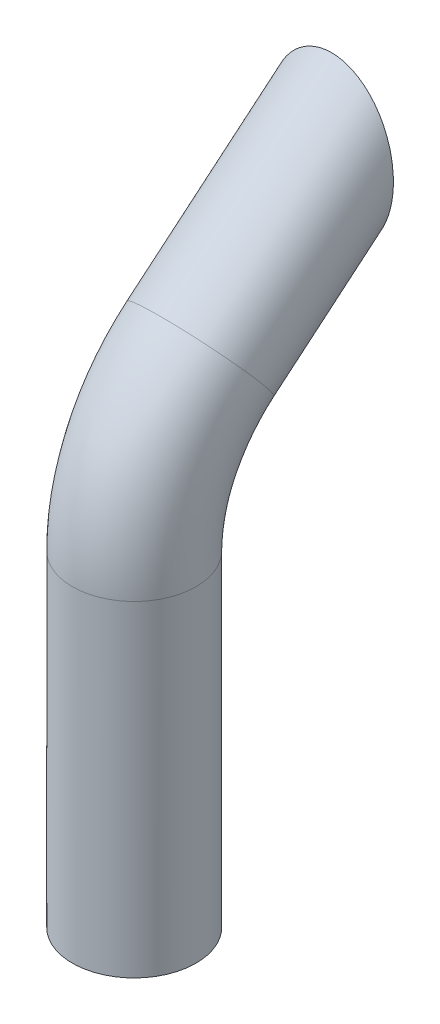
ISO-10303-21;
HEADER;
FILE_DESCRIPTION(('STEP AP214'),'2;1');
FILE_NAME('part.step','',(''),(''),'','','');
FILE_SCHEMA(('AUTOMOTIVE_DESIGN { 1 0 10303 214 1 1 1 1 }'));
ENDSEC;
DATA;
#1=APPLICATION_CONTEXT('core data for automotive mechanical design processes');
#2=APPLICATION_PROTOCOL_DEFINITION('international standard','automotive_design',2000,#1);
#3=PRODUCT_CONTEXT('',#1,'mechanical');
#4=PRODUCT('Part','Part','',(#3));
#5=PRODUCT_RELATED_PRODUCT_CATEGORY('part','',(#4));
#6=PRODUCT_DEFINITION_FORMATION('','',#4);
#7=PRODUCT_DEFINITION_CONTEXT('part definition',#1,'design');
#8=PRODUCT_DEFINITION('design','',#6,#7);
#9=PRODUCT_DEFINITION_SHAPE('','',#8);
#10=(LENGTH_UNIT() NAMED_UNIT(*) SI_UNIT(.MILLI.,.METRE.));
#11=(NAMED_UNIT(*) PLANE_ANGLE_UNIT() SI_UNIT($,.RADIAN.));
#12=(NAMED_UNIT(*) SI_UNIT($,.STERADIAN.) SOLID_ANGLE_UNIT());
#13=UNCERTAINTY_MEASURE_WITH_UNIT(LENGTH_MEASURE(1.E-05),#10,'distance_accuracy_value','');
#14=(GEOMETRIC_REPRESENTATION_CONTEXT(3) GLOBAL_UNCERTAINTY_ASSIGNED_CONTEXT((#13)) GLOBAL_UNIT_ASSIGNED_CONTEXT((#10,
#11,#12)) REPRESENTATION_CONTEXT('',''));
#15=CARTESIAN_POINT('',(0.,0.,0.));
#16=DIRECTION('',(0.,0.,1.));
#17=DIRECTION('',(1.,0.,0.));
#18=AXIS2_PLACEMENT_3D('',#15,#16,#17);
#19=CARTESIAN_POINT('',(0.,-296.418141452981,114.906666467847));
#20=DIRECTION('',(0.,-1.,0.));
#21=DIRECTION('',(0.,0.,-1.));
#22=AXIS2_PLACEMENT_3D('',#19,#20,#21);
#23=PLANE('',#22);
#24=CARTESIAN_POINT('',(0.,-296.418141452981,114.906666467847));
#25=DIRECTION('',(0.,-1.,0.));
#26=DIRECTION('',(0.,0.,-1.));
#27=AXIS2_PLACEMENT_3D('',#24,#25,#26);
#28=CIRCLE('',#27,27.);
#29=CARTESIAN_POINT('',(0.,-296.418141452981,87.9066664678469));
#30=VERTEX_POINT('',#29);
#31=EDGE_CURVE('E53',#30,#30,#28,.T.);
#32=ORIENTED_EDGE('',*,*,#31,.F.);
#33=EDGE_LOOP('',(#32));
#34=FACE_BOUND('',#33,.T.);
#35=CARTESIAN_POINT('',(0.,-296.418141452981,114.906666467847));
#36=DIRECTION('',(0.,-1.,0.));
#37=DIRECTION('',(0.,0.,-1.));
#38=AXIS2_PLACEMENT_3D('',#35,#36,#37);
#39=CIRCLE('',#38,30.);
#40=CARTESIAN_POINT('',(0.,-296.418141452981,84.9066664678469));
#41=VERTEX_POINT('',#40);
#42=EDGE_CURVE('E10',#41,#41,#39,.T.);
#43=ORIENTED_EDGE('',*,*,#42,.T.);
#44=EDGE_LOOP('',(#43));
#45=FACE_BOUND('',#44,.T.);
#46=ADVANCED_FACE('F37',(#34,#45),#23,.T.);
#47=CARTESIAN_POINT('',(0.,0.,0.));
#48=DIRECTION('',(0.,-0.642787609686538,0.766044443118979));
#49=DIRECTION('',(0.,-0.766044443118979,-0.642787609686538));
#50=AXIS2_PLACEMENT_3D('',#47,#48,#49);
#51=CYLINDRICAL_SURFACE('',#50,30.);
#52=CARTESIAN_POINT('',(0.,-16.1808853863989,19.2836282905961));
#53=DIRECTION('',(0.,0.,1.));
#54=DIRECTION('',(0.,-1.,0.));
#55=AXIS2_PLACEMENT_3D('',#52,#53,#54);
#56=ELLIPSE('',#55,39.1622186799683,30.);
#57=CARTESIAN_POINT('',(0.,-55.3431040663672,19.2836282905961));
#58=VERTEX_POINT('',#57);
#59=EDGE_CURVE('E62',#58,#58,#56,.F.);
#60=ORIENTED_EDGE('',*,*,#59,.F.);
#61=EDGE_LOOP('',(#60));
#62=FACE_BOUND('',#61,.T.);
#63=CARTESIAN_POINT('',(0.,-69.4418308062222,82.757551339635));
#64=DIRECTION('',(0.,-0.642787609686538,0.766044443118979));
#65=DIRECTION('',(0.,-0.766044443118979,-0.642787609686538));
#66=AXIS2_PLACEMENT_3D('',#63,#64,#65);
#67=CIRCLE('',#66,30.);
#68=CARTESIAN_POINT('',(0.,-46.4604975126528,102.041179630231));
#69=VERTEX_POINT('',#68);
#70=EDGE_CURVE('E48',#69,#69,#67,.T.);
#71=ORIENTED_EDGE('',*,*,#70,.F.);
#72=EDGE_LOOP('',(#71));
#73=FACE_BOUND('',#72,.T.);
#74=ADVANCED_FACE('F92',(#62,#73),#51,.T.);
#75=CARTESIAN_POINT('',(0.,-138.385830686931,24.9066664678469));
#76=DIRECTION('',(1.,0.,0.));
#77=DIRECTION('',(0.,0.,-1.));
#78=AXIS2_PLACEMENT_3D('',#75,#76,#77);
#79=TOROIDAL_SURFACE('',#78,90.,30.);
#80=CARTESIAN_POINT('',(0.,-138.385830686931,114.906666467847));
#81=DIRECTION('',(0.,-1.,0.));
#82=DIRECTION('',(0.,0.,-1.));
#83=AXIS2_PLACEMENT_3D('',#80,#81,#82);
#84=CIRCLE('',#83,30.);
#85=CARTESIAN_POINT('',(0.,-138.385830686931,144.906666467847));
#86=VERTEX_POINT('',#85);
#87=EDGE_CURVE('E44',#86,#86,#84,.T.);
#88=CARTESIAN_POINT('',(0.,-138.385830686931,24.9066664678469));
#89=DIRECTION('',(1.,0.,0.));
#90=DIRECTION('',(0.,0.,-1.));
#91=AXIS2_PLACEMENT_3D('',#88,#89,#90);
#92=CIRCLE('',#91,120.);
#93=EDGE_CURVE('',#69,#86,#92,.T.);
#94=ORIENTED_EDGE('',*,*,#70,.T.);
#95=ORIENTED_EDGE('',*,*,#87,.F.);
#96=ORIENTED_EDGE('',*,*,#93,.T.);
#97=ORIENTED_EDGE('',*,*,#93,.F.);
#98=EDGE_LOOP('',(#94,#96,#95,#97));
#99=FACE_BOUND('',#98,.T.);
#100=ADVANCED_FACE('F86',(#99),#79,.T.);
#101=CARTESIAN_POINT('',(0.,-138.385830686931,114.906666467847));
#102=DIRECTION('',(0.,-1.,0.));
#103=DIRECTION('',(0.,0.,-1.));
#104=AXIS2_PLACEMENT_3D('',#101,#102,#103);
#105=CYLINDRICAL_SURFACE('',#104,30.);
#106=ORIENTED_EDGE('',*,*,#42,.F.);
#107=EDGE_LOOP('',(#106));
#108=FACE_BOUND('',#107,.T.);
#109=ORIENTED_EDGE('',*,*,#87,.T.);
#110=EDGE_LOOP('',(#109));
#111=FACE_BOUND('',#110,.T.);
#112=ADVANCED_FACE('F84',(#108,#111),#105,.T.);
#113=CARTESIAN_POINT('',(0.,0.,0.));
#114=DIRECTION('',(0.,-0.642787609686538,0.766044443118979));
#115=DIRECTION('',(0.,-0.766044443118979,-0.642787609686538));
#116=AXIS2_PLACEMENT_3D('',#113,#114,#115);
#117=CYLINDRICAL_SURFACE('',#116,27.);
#118=CARTESIAN_POINT('',(0.,-16.1808853863989,19.2836282905961));
#119=DIRECTION('',(0.,0.,1.));
#120=DIRECTION('',(0.,-1.,0.));
#121=AXIS2_PLACEMENT_3D('',#118,#119,#120);
#122=ELLIPSE('',#121,35.2459968119715,27.);
#123=CARTESIAN_POINT('',(0.,-51.4268821983704,19.2836282905961));
#124=VERTEX_POINT('',#123);
#125=EDGE_CURVE('E40',#124,#124,#122,.F.);
#126=ORIENTED_EDGE('',*,*,#125,.T.);
#127=EDGE_LOOP('',(#126));
#128=FACE_BOUND('',#127,.T.);
#129=CARTESIAN_POINT('',(0.,-69.4418308062223,82.7575513396351));
#130=DIRECTION('',(0.,0.642787609686535,-0.766044443118981));
#131=DIRECTION('',(0.,0.766044443118981,0.642787609686535));
#132=AXIS2_PLACEMENT_3D('',#129,#130,#131);
#133=CIRCLE('',#132,27.);
#134=CARTESIAN_POINT('',(0.,-48.7586308420098,100.112816801171));
#135=VERTEX_POINT('',#134);
#136=EDGE_CURVE('E59',#135,#135,#133,.F.);
#137=ORIENTED_EDGE('',*,*,#136,.T.);
#138=EDGE_LOOP('',(#137));
#139=FACE_BOUND('',#138,.T.);
#140=ADVANCED_FACE('F69',(#128,#139),#117,.F.);
#141=CARTESIAN_POINT('',(0.,-138.385830686931,24.9066664678469));
#142=DIRECTION('',(1.,0.,0.));
#143=DIRECTION('',(0.,0.,-1.));
#144=AXIS2_PLACEMENT_3D('',#141,#142,#143);
#145=TOROIDAL_SURFACE('',#144,90.,27.);
#146=CARTESIAN_POINT('',(0.,-138.385830686931,114.906666467847));
#147=DIRECTION('',(0.,-1.,0.));
#148=DIRECTION('',(0.,0.,-1.));
#149=AXIS2_PLACEMENT_3D('',#146,#147,#148);
#150=CIRCLE('',#149,27.);
#151=CARTESIAN_POINT('',(0.,-138.385830686931,141.906666467847));
#152=VERTEX_POINT('',#151);
#153=EDGE_CURVE('E56',#152,#152,#150,.T.);
#154=CARTESIAN_POINT('',(0.,-138.385830686931,24.9066664678469));
#155=DIRECTION('',(1.,0.,0.));
#156=DIRECTION('',(0.,0.,-1.));
#157=AXIS2_PLACEMENT_3D('',#154,#155,#156);
#158=CIRCLE('',#157,117.);
#159=EDGE_CURVE('',#135,#152,#158,.T.);
#160=ORIENTED_EDGE('',*,*,#136,.F.);
#161=ORIENTED_EDGE('',*,*,#153,.T.);
#162=ORIENTED_EDGE('',*,*,#159,.T.);
#163=ORIENTED_EDGE('',*,*,#159,.F.);
#164=EDGE_LOOP('',(#160,#162,#161,#163));
#165=FACE_BOUND('',#164,.T.);
#166=ADVANCED_FACE('F80',(#165),#145,.F.);
#167=CARTESIAN_POINT('',(0.,-138.385830686931,114.906666467847));
#168=DIRECTION('',(0.,-1.,0.));
#169=DIRECTION('',(0.,0.,-1.));
#170=AXIS2_PLACEMENT_3D('',#167,#168,#169);
#171=CYLINDRICAL_SURFACE('',#170,27.);
#172=ORIENTED_EDGE('',*,*,#31,.T.);
#173=EDGE_LOOP('',(#172));
#174=FACE_BOUND('',#173,.T.);
#175=ORIENTED_EDGE('',*,*,#153,.F.);
#176=EDGE_LOOP('',(#175));
#177=FACE_BOUND('',#176,.T.);
#178=ADVANCED_FACE('F74',(#174,#177),#171,.F.);
#179=CARTESIAN_POINT('',(-75.,22.9813332935694,19.2836282905961));
#180=DIRECTION('',(0.,0.,1.));
#181=DIRECTION('',(1.,0.,0.));
#182=AXIS2_PLACEMENT_3D('',#179,#180,#181);
#183=PLANE('',#182);
#184=ORIENTED_EDGE('',*,*,#59,.T.);
#185=EDGE_LOOP('',(#184));
#186=FACE_BOUND('',#185,.T.);
#187=ORIENTED_EDGE('',*,*,#125,.F.);
#188=EDGE_LOOP('',(#187));
#189=FACE_BOUND('',#188,.T.);
#190=ADVANCED_FACE('F72',(#186,#189),#183,.F.);
#191=CLOSED_SHELL('',(#46,#74,#100,#112,#140,#166,#178,#190));
#192=MANIFOLD_SOLID_BREP('B2',#191);
#193=ADVANCED_BREP_SHAPE_REPRESENTATION('',(#18,#192),#14);
#194=SHAPE_DEFINITION_REPRESENTATION(#9,#193);
ENDSEC;
END-ISO-10303-21;
